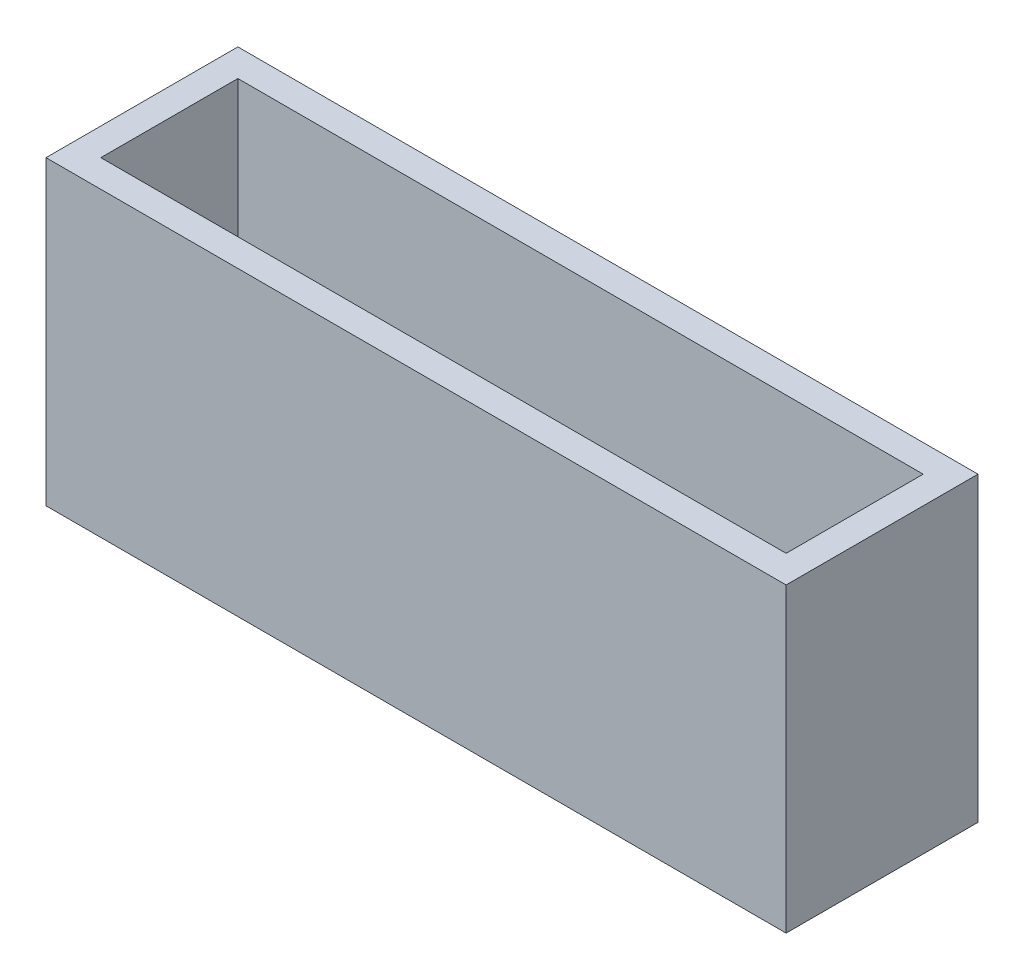
ISO-10303-21;
HEADER;
FILE_DESCRIPTION(('STEP AP214'),'2;1');
FILE_NAME('part.step','',(''),(''),'','','');
FILE_SCHEMA(('AUTOMOTIVE_DESIGN { 1 0 10303 214 1 1 1 1 }'));
ENDSEC;
DATA;
#1=APPLICATION_CONTEXT('core data for automotive mechanical design processes');
#2=APPLICATION_PROTOCOL_DEFINITION('international standard','automotive_design',2000,#1);
#3=PRODUCT_CONTEXT('',#1,'mechanical');
#4=PRODUCT('Part','Part','',(#3));
#5=PRODUCT_RELATED_PRODUCT_CATEGORY('part','',(#4));
#6=PRODUCT_DEFINITION_FORMATION('','',#4);
#7=PRODUCT_DEFINITION_CONTEXT('part definition',#1,'design');
#8=PRODUCT_DEFINITION('design','',#6,#7);
#9=PRODUCT_DEFINITION_SHAPE('','',#8);
#10=(LENGTH_UNIT() NAMED_UNIT(*) SI_UNIT(.MILLI.,.METRE.));
#11=(NAMED_UNIT(*) PLANE_ANGLE_UNIT() SI_UNIT($,.RADIAN.));
#12=(NAMED_UNIT(*) SI_UNIT($,.STERADIAN.) SOLID_ANGLE_UNIT());
#13=UNCERTAINTY_MEASURE_WITH_UNIT(LENGTH_MEASURE(1.E-05),#10,'distance_accuracy_value','');
#14=(GEOMETRIC_REPRESENTATION_CONTEXT(3) GLOBAL_UNCERTAINTY_ASSIGNED_CONTEXT((#13)) GLOBAL_UNIT_ASSIGNED_CONTEXT((#10,
#11,#12)) REPRESENTATION_CONTEXT('',''));
#15=CARTESIAN_POINT('',(0.,0.,0.));
#16=DIRECTION('',(0.,0.,1.));
#17=DIRECTION('',(1.,0.,0.));
#18=AXIS2_PLACEMENT_3D('',#15,#16,#17);
#19=CARTESIAN_POINT('',(-25.,22.,-5.));
#20=DIRECTION('',(0.,0.,1.));
#21=DIRECTION('',(1.,0.,0.));
#22=AXIS2_PLACEMENT_3D('',#19,#20,#21);
#23=PLANE('',#22);
#24=DIRECTION('',(0.,-1.,0.));
#25=VECTOR('',#24,1.);
#26=CARTESIAN_POINT('',(18.,2.,-5.));
#27=LINE('',#26,#25);
#28=CARTESIAN_POINT('',(18.,2.,-5.));
#29=VERTEX_POINT('',#28);
#30=CARTESIAN_POINT('',(18.,0.,-5.));
#31=VERTEX_POINT('',#30);
#32=EDGE_CURVE('E147',#29,#31,#27,.T.);
#33=ORIENTED_EDGE('',*,*,#32,.F.);
#34=DIRECTION('',(1.,0.,0.));
#35=VECTOR('',#34,1.);
#36=CARTESIAN_POINT('',(0.,2.,-5.));
#37=LINE('',#36,#35);
#38=CARTESIAN_POINT('',(25.,2.,-5.));
#39=VERTEX_POINT('',#38);
#40=EDGE_CURVE('E131',#29,#39,#37,.T.);
#41=ORIENTED_EDGE('',*,*,#40,.T.);
#42=DIRECTION('',(0.,-1.,0.));
#43=VECTOR('',#42,1.);
#44=CARTESIAN_POINT('',(25.,22.,-5.));
#45=LINE('',#44,#43);
#46=CARTESIAN_POINT('',(25.,22.,-5.));
#47=VERTEX_POINT('',#46);
#48=EDGE_CURVE('E144',#47,#39,#45,.T.);
#49=ORIENTED_EDGE('',*,*,#48,.F.);
#50=DIRECTION('',(-1.,0.,0.));
#51=VECTOR('',#50,1.);
#52=CARTESIAN_POINT('',(-25.,22.,-5.));
#53=LINE('',#52,#51);
#54=CARTESIAN_POINT('',(-25.,22.,-5.));
#55=VERTEX_POINT('',#54);
#56=EDGE_CURVE('E397',#47,#55,#53,.T.);
#57=ORIENTED_EDGE('',*,*,#56,.T.);
#58=DIRECTION('',(0.,-1.,0.));
#59=VECTOR('',#58,1.);
#60=CARTESIAN_POINT('',(-25.,22.,-5.));
#61=LINE('',#60,#59);
#62=CARTESIAN_POINT('',(-25.,2.,-5.));
#63=VERTEX_POINT('',#62);
#64=EDGE_CURVE('E154',#55,#63,#61,.T.);
#65=ORIENTED_EDGE('',*,*,#64,.T.);
#66=DIRECTION('',(1.,0.,0.));
#67=VECTOR('',#66,1.);
#68=CARTESIAN_POINT('',(0.,2.,-5.));
#69=LINE('',#68,#67);
#70=CARTESIAN_POINT('',(-18.,2.,-5.));
#71=VERTEX_POINT('',#70);
#72=EDGE_CURVE('E384',#63,#71,#69,.T.);
#73=ORIENTED_EDGE('',*,*,#72,.T.);
#74=DIRECTION('',(0.,-1.,0.));
#75=VECTOR('',#74,1.);
#76=CARTESIAN_POINT('',(-18.,2.,-5.));
#77=LINE('',#76,#75);
#78=CARTESIAN_POINT('',(-18.,0.,-5.));
#79=VERTEX_POINT('',#78);
#80=EDGE_CURVE('E387',#71,#79,#77,.T.);
#81=ORIENTED_EDGE('',*,*,#80,.T.);
#82=DIRECTION('',(-1.,0.,0.));
#83=VECTOR('',#82,1.);
#84=CARTESIAN_POINT('',(-25.,0.,-5.));
#85=LINE('',#84,#83);
#86=EDGE_CURVE('E395',#31,#79,#85,.T.);
#87=ORIENTED_EDGE('',*,*,#86,.F.);
#88=EDGE_LOOP('',(#33,#41,#49,#57,#65,#73,#81,#87));
#89=FACE_BOUND('',#88,.T.);
#90=ADVANCED_FACE('F37',(#89),#23,.T.);
#91=CARTESIAN_POINT('',(-25.,22.,5.));
#92=DIRECTION('',(0.,0.,-1.));
#93=DIRECTION('',(-1.,0.,0.));
#94=AXIS2_PLACEMENT_3D('',#91,#92,#93);
#95=PLANE('',#94);
#96=DIRECTION('',(0.,-1.,0.));
#97=VECTOR('',#96,1.);
#98=CARTESIAN_POINT('',(18.,2.,5.));
#99=LINE('',#98,#97);
#100=CARTESIAN_POINT('',(18.,2.,5.));
#101=VERTEX_POINT('',#100);
#102=CARTESIAN_POINT('',(18.,0.,5.));
#103=VERTEX_POINT('',#102);
#104=EDGE_CURVE('E368',#101,#103,#99,.T.);
#105=ORIENTED_EDGE('',*,*,#104,.T.);
#106=DIRECTION('',(1.,0.,0.));
#107=VECTOR('',#106,1.);
#108=CARTESIAN_POINT('',(-25.,0.,5.));
#109=LINE('',#108,#107);
#110=CARTESIAN_POINT('',(-18.,0.,5.));
#111=VERTEX_POINT('',#110);
#112=EDGE_CURVE('E398',#111,#103,#109,.T.);
#113=ORIENTED_EDGE('',*,*,#112,.F.);
#114=DIRECTION('',(0.,-1.,0.));
#115=VECTOR('',#114,1.);
#116=CARTESIAN_POINT('',(-18.,2.,5.));
#117=LINE('',#116,#115);
#118=CARTESIAN_POINT('',(-18.,2.,5.));
#119=VERTEX_POINT('',#118);
#120=EDGE_CURVE('E393',#119,#111,#117,.T.);
#121=ORIENTED_EDGE('',*,*,#120,.F.);
#122=DIRECTION('',(1.,0.,0.));
#123=VECTOR('',#122,1.);
#124=CARTESIAN_POINT('',(0.,2.,5.));
#125=LINE('',#124,#123);
#126=CARTESIAN_POINT('',(-25.,2.,5.));
#127=VERTEX_POINT('',#126);
#128=EDGE_CURVE('E380',#127,#119,#125,.T.);
#129=ORIENTED_EDGE('',*,*,#128,.F.);
#130=DIRECTION('',(0.,-1.,0.));
#131=VECTOR('',#130,1.);
#132=CARTESIAN_POINT('',(-25.,22.,5.));
#133=LINE('',#132,#131);
#134=CARTESIAN_POINT('',(-25.,22.,5.));
#135=VERTEX_POINT('',#134);
#136=EDGE_CURVE('E60',#135,#127,#133,.T.);
#137=ORIENTED_EDGE('',*,*,#136,.F.);
#138=DIRECTION('',(1.,0.,0.));
#139=VECTOR('',#138,1.);
#140=CARTESIAN_POINT('',(-25.,22.,5.));
#141=LINE('',#140,#139);
#142=CARTESIAN_POINT('',(25.,22.,5.));
#143=VERTEX_POINT('',#142);
#144=EDGE_CURVE('E402',#135,#143,#141,.T.);
#145=ORIENTED_EDGE('',*,*,#144,.T.);
#146=DIRECTION('',(0.,-1.,0.));
#147=VECTOR('',#146,1.);
#148=CARTESIAN_POINT('',(25.,22.,5.));
#149=LINE('',#148,#147);
#150=CARTESIAN_POINT('',(25.,2.,5.));
#151=VERTEX_POINT('',#150);
#152=EDGE_CURVE('E404',#143,#151,#149,.T.);
#153=ORIENTED_EDGE('',*,*,#152,.T.);
#154=DIRECTION('',(1.,0.,0.));
#155=VECTOR('',#154,1.);
#156=CARTESIAN_POINT('',(0.,2.,5.00000000000003));
#157=LINE('',#156,#155);
#158=EDGE_CURVE('E134',#101,#151,#157,.T.);
#159=ORIENTED_EDGE('',*,*,#158,.F.);
#160=EDGE_LOOP('',(#105,#113,#121,#129,#137,#145,#153,#159));
#161=FACE_BOUND('',#160,.T.);
#162=ADVANCED_FACE('F213',(#161),#95,.T.);
#163=CARTESIAN_POINT('',(0.,22.,0.));
#164=DIRECTION('',(0.,-1.,0.));
#165=DIRECTION('',(0.,0.,-1.));
#166=AXIS2_PLACEMENT_3D('',#163,#164,#165);
#167=PLANE('',#166);
#168=DIRECTION('',(0.,0.,-1.));
#169=VECTOR('',#168,1.);
#170=CARTESIAN_POINT('',(27.,22.,7.));
#171=LINE('',#170,#169);
#172=CARTESIAN_POINT('',(27.,22.,7.));
#173=VERTEX_POINT('',#172);
#174=CARTESIAN_POINT('',(27.,22.,-7.));
#175=VERTEX_POINT('',#174);
#176=EDGE_CURVE('E163',#173,#175,#171,.T.);
#177=ORIENTED_EDGE('',*,*,#176,.T.);
#178=DIRECTION('',(-1.,0.,0.));
#179=VECTOR('',#178,1.);
#180=CARTESIAN_POINT('',(-27.,22.,-7.));
#181=LINE('',#180,#179);
#182=CARTESIAN_POINT('',(-27.,22.,-7.));
#183=VERTEX_POINT('',#182);
#184=EDGE_CURVE('E166',#175,#183,#181,.T.);
#185=ORIENTED_EDGE('',*,*,#184,.T.);
#186=DIRECTION('',(0.,0.,1.));
#187=VECTOR('',#186,1.);
#188=CARTESIAN_POINT('',(-27.,22.,7.));
#189=LINE('',#188,#187);
#190=CARTESIAN_POINT('',(-27.,22.,7.));
#191=VERTEX_POINT('',#190);
#192=EDGE_CURVE('E169',#183,#191,#189,.T.);
#193=ORIENTED_EDGE('',*,*,#192,.T.);
#194=DIRECTION('',(1.,0.,0.));
#195=VECTOR('',#194,1.);
#196=CARTESIAN_POINT('',(-27.,22.,7.));
#197=LINE('',#196,#195);
#198=EDGE_CURVE('E171',#191,#173,#197,.T.);
#199=ORIENTED_EDGE('',*,*,#198,.T.);
#200=EDGE_LOOP('',(#177,#185,#193,#199));
#201=FACE_BOUND('',#200,.T.);
#202=DIRECTION('',(0.,0.,-1.));
#203=VECTOR('',#202,1.);
#204=CARTESIAN_POINT('',(25.,22.,5.));
#205=LINE('',#204,#203);
#206=EDGE_CURVE('E152',#143,#47,#205,.T.);
#207=ORIENTED_EDGE('',*,*,#206,.F.);
#208=ORIENTED_EDGE('',*,*,#144,.F.);
#209=DIRECTION('',(0.,0.,1.));
#210=VECTOR('',#209,1.);
#211=CARTESIAN_POINT('',(-25.,22.,5.));
#212=LINE('',#211,#210);
#213=EDGE_CURVE('E400',#55,#135,#212,.T.);
#214=ORIENTED_EDGE('',*,*,#213,.F.);
#215=ORIENTED_EDGE('',*,*,#56,.F.);
#216=EDGE_LOOP('',(#207,#208,#214,#215));
#217=FACE_BOUND('',#216,.T.);
#218=ADVANCED_FACE('F203',(#201,#217),#167,.F.);
#219=CARTESIAN_POINT('',(0.,0.,0.));
#220=DIRECTION('',(0.,-1.,0.));
#221=DIRECTION('',(0.,0.,-1.));
#222=AXIS2_PLACEMENT_3D('',#219,#220,#221);
#223=PLANE('',#222);
#224=DIRECTION('',(0.,0.,-1.));
#225=VECTOR('',#224,1.);
#226=CARTESIAN_POINT('',(18.,0.,0.));
#227=LINE('',#226,#225);
#228=EDGE_CURVE('E360',#103,#31,#227,.T.);
#229=ORIENTED_EDGE('',*,*,#228,.T.);
#230=ORIENTED_EDGE('',*,*,#86,.T.);
#231=DIRECTION('',(0.,0.,-1.));
#232=VECTOR('',#231,1.);
#233=CARTESIAN_POINT('',(-18.,0.,0.));
#234=LINE('',#233,#232);
#235=EDGE_CURVE('E52',#111,#79,#234,.T.);
#236=ORIENTED_EDGE('',*,*,#235,.F.);
#237=ORIENTED_EDGE('',*,*,#112,.T.);
#238=EDGE_LOOP('',(#229,#230,#236,#237));
#239=FACE_BOUND('',#238,.T.);
#240=DIRECTION('',(0.,0.,-1.));
#241=VECTOR('',#240,1.);
#242=CARTESIAN_POINT('',(27.,0.,7.));
#243=LINE('',#242,#241);
#244=CARTESIAN_POINT('',(27.,0.,7.));
#245=VERTEX_POINT('',#244);
#246=CARTESIAN_POINT('',(27.,0.,-7.));
#247=VERTEX_POINT('',#246);
#248=EDGE_CURVE('E153',#245,#247,#243,.T.);
#249=ORIENTED_EDGE('',*,*,#248,.F.);
#250=DIRECTION('',(1.,0.,0.));
#251=VECTOR('',#250,1.);
#252=CARTESIAN_POINT('',(-27.,0.,7.));
#253=LINE('',#252,#251);
#254=CARTESIAN_POINT('',(-27.,0.,7.));
#255=VERTEX_POINT('',#254);
#256=EDGE_CURVE('E167',#255,#245,#253,.T.);
#257=ORIENTED_EDGE('',*,*,#256,.F.);
#258=DIRECTION('',(0.,0.,1.));
#259=VECTOR('',#258,1.);
#260=CARTESIAN_POINT('',(-27.,0.,7.));
#261=LINE('',#260,#259);
#262=CARTESIAN_POINT('',(-27.,0.,-7.));
#263=VERTEX_POINT('',#262);
#264=EDGE_CURVE('E175',#263,#255,#261,.T.);
#265=ORIENTED_EDGE('',*,*,#264,.F.);
#266=DIRECTION('',(-1.,0.,0.));
#267=VECTOR('',#266,1.);
#268=CARTESIAN_POINT('',(-27.,0.,-7.));
#269=LINE('',#268,#267);
#270=EDGE_CURVE('E157',#247,#263,#269,.T.);
#271=ORIENTED_EDGE('',*,*,#270,.F.);
#272=EDGE_LOOP('',(#249,#257,#265,#271));
#273=FACE_BOUND('',#272,.T.);
#274=CARTESIAN_POINT('',(-21.5,0.,0.));
#275=DIRECTION('',(0.,1.,0.));
#276=DIRECTION('',(0.,0.,1.));
#277=AXIS2_PLACEMENT_3D('',#274,#275,#276);
#278=CIRCLE('',#277,1.);
#279=CARTESIAN_POINT('',(-21.5,0.,1.));
#280=VERTEX_POINT('',#279);
#281=EDGE_CURVE('E374',#280,#280,#278,.T.);
#282=ORIENTED_EDGE('',*,*,#281,.T.);
#283=EDGE_LOOP('',(#282));
#284=FACE_BOUND('',#283,.T.);
#285=CARTESIAN_POINT('',(21.5,0.,0.));
#286=DIRECTION('',(0.,1.,0.));
#287=DIRECTION('',(0.,0.,1.));
#288=AXIS2_PLACEMENT_3D('',#285,#286,#287);
#289=CIRCLE('',#288,1.);
#290=CARTESIAN_POINT('',(21.5,0.,1.));
#291=VERTEX_POINT('',#290);
#292=EDGE_CURVE('E363',#291,#291,#289,.T.);
#293=ORIENTED_EDGE('',*,*,#292,.T.);
#294=EDGE_LOOP('',(#293));
#295=FACE_BOUND('',#294,.T.);
#296=ADVANCED_FACE('F193',(#239,#273,#284,#295),#223,.T.);
#297=CARTESIAN_POINT('',(27.,22.,7.));
#298=DIRECTION('',(-1.,0.,0.));
#299=DIRECTION('',(0.,0.,1.));
#300=AXIS2_PLACEMENT_3D('',#297,#298,#299);
#301=PLANE('',#300);
#302=ORIENTED_EDGE('',*,*,#248,.T.);
#303=DIRECTION('',(0.,-1.,0.));
#304=VECTOR('',#303,1.);
#305=CARTESIAN_POINT('',(27.,22.,-7.));
#306=LINE('',#305,#304);
#307=EDGE_CURVE('E11',#175,#247,#306,.T.);
#308=ORIENTED_EDGE('',*,*,#307,.F.);
#309=ORIENTED_EDGE('',*,*,#176,.F.);
#310=DIRECTION('',(0.,-1.,0.));
#311=VECTOR('',#310,1.);
#312=CARTESIAN_POINT('',(27.,22.,7.));
#313=LINE('',#312,#311);
#314=EDGE_CURVE('E172',#173,#245,#313,.T.);
#315=ORIENTED_EDGE('',*,*,#314,.T.);
#316=EDGE_LOOP('',(#302,#308,#309,#315));
#317=FACE_BOUND('',#316,.T.);
#318=ADVANCED_FACE('F39',(#317),#301,.F.);
#319=CARTESIAN_POINT('',(-27.,22.,-7.));
#320=DIRECTION('',(0.,0.,1.));
#321=DIRECTION('',(1.,0.,0.));
#322=AXIS2_PLACEMENT_3D('',#319,#320,#321);
#323=PLANE('',#322);
#324=ORIENTED_EDGE('',*,*,#270,.T.);
#325=DIRECTION('',(0.,-1.,0.));
#326=VECTOR('',#325,1.);
#327=CARTESIAN_POINT('',(-27.,22.,-7.));
#328=LINE('',#327,#326);
#329=EDGE_CURVE('E45',#183,#263,#328,.T.);
#330=ORIENTED_EDGE('',*,*,#329,.F.);
#331=ORIENTED_EDGE('',*,*,#184,.F.);
#332=ORIENTED_EDGE('',*,*,#307,.T.);
#333=EDGE_LOOP('',(#324,#330,#331,#332));
#334=FACE_BOUND('',#333,.T.);
#335=ADVANCED_FACE('F205',(#334),#323,.F.);
#336=CARTESIAN_POINT('',(-27.,22.,7.));
#337=DIRECTION('',(1.,0.,0.));
#338=DIRECTION('',(0.,0.,-1.));
#339=AXIS2_PLACEMENT_3D('',#336,#337,#338);
#340=PLANE('',#339);
#341=ORIENTED_EDGE('',*,*,#264,.T.);
#342=DIRECTION('',(0.,-1.,0.));
#343=VECTOR('',#342,1.);
#344=CARTESIAN_POINT('',(-27.,22.,7.));
#345=LINE('',#344,#343);
#346=EDGE_CURVE('E180',#191,#255,#345,.T.);
#347=ORIENTED_EDGE('',*,*,#346,.F.);
#348=ORIENTED_EDGE('',*,*,#192,.F.);
#349=ORIENTED_EDGE('',*,*,#329,.T.);
#350=EDGE_LOOP('',(#341,#347,#348,#349));
#351=FACE_BOUND('',#350,.T.);
#352=ADVANCED_FACE('F187',(#351),#340,.F.);
#353=CARTESIAN_POINT('',(-27.,22.,7.));
#354=DIRECTION('',(0.,0.,-1.));
#355=DIRECTION('',(-1.,0.,0.));
#356=AXIS2_PLACEMENT_3D('',#353,#354,#355);
#357=PLANE('',#356);
#358=ORIENTED_EDGE('',*,*,#256,.T.);
#359=ORIENTED_EDGE('',*,*,#314,.F.);
#360=ORIENTED_EDGE('',*,*,#198,.F.);
#361=ORIENTED_EDGE('',*,*,#346,.T.);
#362=EDGE_LOOP('',(#358,#359,#360,#361));
#363=FACE_BOUND('',#362,.T.);
#364=ADVANCED_FACE('F197',(#363),#357,.F.);
#365=CARTESIAN_POINT('',(25.,22.,5.));
#366=DIRECTION('',(-1.,0.,0.));
#367=DIRECTION('',(0.,0.,1.));
#368=AXIS2_PLACEMENT_3D('',#365,#366,#367);
#369=PLANE('',#368);
#370=DIRECTION('',(0.,0.,1.));
#371=VECTOR('',#370,1.);
#372=CARTESIAN_POINT('',(25.,2.,0.));
#373=LINE('',#372,#371);
#374=EDGE_CURVE('E127',#39,#151,#373,.T.);
#375=ORIENTED_EDGE('',*,*,#374,.T.);
#376=ORIENTED_EDGE('',*,*,#152,.F.);
#377=ORIENTED_EDGE('',*,*,#206,.T.);
#378=ORIENTED_EDGE('',*,*,#48,.T.);
#379=EDGE_LOOP('',(#375,#376,#377,#378));
#380=FACE_BOUND('',#379,.T.);
#381=ADVANCED_FACE('F150',(#380),#369,.T.);
#382=CARTESIAN_POINT('',(-25.,22.,5.));
#383=DIRECTION('',(1.,0.,0.));
#384=DIRECTION('',(0.,0.,-1.));
#385=AXIS2_PLACEMENT_3D('',#382,#383,#384);
#386=PLANE('',#385);
#387=DIRECTION('',(0.,0.,1.));
#388=VECTOR('',#387,1.);
#389=CARTESIAN_POINT('',(-25.,2.,0.));
#390=LINE('',#389,#388);
#391=EDGE_CURVE('E378',#63,#127,#390,.T.);
#392=ORIENTED_EDGE('',*,*,#391,.F.);
#393=ORIENTED_EDGE('',*,*,#64,.F.);
#394=ORIENTED_EDGE('',*,*,#213,.T.);
#395=ORIENTED_EDGE('',*,*,#136,.T.);
#396=EDGE_LOOP('',(#392,#393,#394,#395));
#397=FACE_BOUND('',#396,.T.);
#398=ADVANCED_FACE('F221',(#397),#386,.T.);
#399=CARTESIAN_POINT('',(-18.,2.,0.));
#400=DIRECTION('',(-1.,0.,0.));
#401=DIRECTION('',(0.,0.,1.));
#402=AXIS2_PLACEMENT_3D('',#399,#400,#401);
#403=PLANE('',#402);
#404=ORIENTED_EDGE('',*,*,#235,.T.);
#405=ORIENTED_EDGE('',*,*,#80,.F.);
#406=DIRECTION('',(0.,0.,-1.));
#407=VECTOR('',#406,1.);
#408=CARTESIAN_POINT('',(-18.,2.,0.));
#409=LINE('',#408,#407);
#410=EDGE_CURVE('E382',#119,#71,#409,.T.);
#411=ORIENTED_EDGE('',*,*,#410,.F.);
#412=ORIENTED_EDGE('',*,*,#120,.T.);
#413=EDGE_LOOP('',(#404,#405,#411,#412));
#414=FACE_BOUND('',#413,.T.);
#415=ADVANCED_FACE('F244',(#414),#403,.F.);
#416=CARTESIAN_POINT('',(-21.5,2.,0.));
#417=DIRECTION('',(0.,-1.,0.));
#418=DIRECTION('',(0.,0.,-1.));
#419=AXIS2_PLACEMENT_3D('',#416,#417,#418);
#420=CYLINDRICAL_SURFACE('',#419,1.);
#421=CARTESIAN_POINT('',(-21.5,2.,0.));
#422=DIRECTION('',(0.,1.,0.));
#423=DIRECTION('',(0.,0.,1.));
#424=AXIS2_PLACEMENT_3D('',#421,#422,#423);
#425=CIRCLE('',#424,1.);
#426=CARTESIAN_POINT('',(-21.5,2.,1.));
#427=VERTEX_POINT('',#426);
#428=EDGE_CURVE('E375',#427,#427,#425,.T.);
#429=ORIENTED_EDGE('',*,*,#428,.T.);
#430=EDGE_LOOP('',(#429));
#431=FACE_BOUND('',#430,.T.);
#432=ORIENTED_EDGE('',*,*,#281,.F.);
#433=EDGE_LOOP('',(#432));
#434=FACE_BOUND('',#433,.T.);
#435=ADVANCED_FACE('F251',(#431,#434),#420,.F.);
#436=CARTESIAN_POINT('',(0.,2.,0.));
#437=DIRECTION('',(0.,1.,0.));
#438=DIRECTION('',(0.,0.,1.));
#439=AXIS2_PLACEMENT_3D('',#436,#437,#438);
#440=PLANE('',#439);
#441=ORIENTED_EDGE('',*,*,#428,.F.);
#442=EDGE_LOOP('',(#441));
#443=FACE_BOUND('',#442,.T.);
#444=ORIENTED_EDGE('',*,*,#391,.T.);
#445=ORIENTED_EDGE('',*,*,#128,.T.);
#446=ORIENTED_EDGE('',*,*,#410,.T.);
#447=ORIENTED_EDGE('',*,*,#72,.F.);
#448=EDGE_LOOP('',(#444,#445,#446,#447));
#449=FACE_BOUND('',#448,.T.);
#450=ADVANCED_FACE('F259',(#443,#449),#440,.T.);
#451=CARTESIAN_POINT('',(18.,2.,0.));
#452=DIRECTION('',(-1.,0.,0.));
#453=DIRECTION('',(0.,0.,1.));
#454=AXIS2_PLACEMENT_3D('',#451,#452,#453);
#455=PLANE('',#454);
#456=ORIENTED_EDGE('',*,*,#228,.F.);
#457=ORIENTED_EDGE('',*,*,#104,.F.);
#458=DIRECTION('',(0.,0.,-1.));
#459=VECTOR('',#458,1.);
#460=CARTESIAN_POINT('',(18.,2.,0.));
#461=LINE('',#460,#459);
#462=EDGE_CURVE('E148',#101,#29,#461,.T.);
#463=ORIENTED_EDGE('',*,*,#462,.T.);
#464=ORIENTED_EDGE('',*,*,#32,.T.);
#465=EDGE_LOOP('',(#456,#457,#463,#464));
#466=FACE_BOUND('',#465,.T.);
#467=ADVANCED_FACE('F267',(#466),#455,.T.);
#468=CARTESIAN_POINT('',(21.5,2.,0.));
#469=DIRECTION('',(0.,-1.,0.));
#470=DIRECTION('',(0.,0.,-1.));
#471=AXIS2_PLACEMENT_3D('',#468,#469,#470);
#472=CYLINDRICAL_SURFACE('',#471,1.);
#473=CARTESIAN_POINT('',(21.5,2.,0.));
#474=DIRECTION('',(0.,1.,0.));
#475=DIRECTION('',(0.,0.,1.));
#476=AXIS2_PLACEMENT_3D('',#473,#474,#475);
#477=CIRCLE('',#476,1.);
#478=CARTESIAN_POINT('',(21.5,2.,1.));
#479=VERTEX_POINT('',#478);
#480=EDGE_CURVE('E139',#479,#479,#477,.T.);
#481=ORIENTED_EDGE('',*,*,#480,.T.);
#482=EDGE_LOOP('',(#481));
#483=FACE_BOUND('',#482,.T.);
#484=ORIENTED_EDGE('',*,*,#292,.F.);
#485=EDGE_LOOP('',(#484));
#486=FACE_BOUND('',#485,.T.);
#487=ADVANCED_FACE('F275',(#483,#486),#472,.F.);
#488=CARTESIAN_POINT('',(0.,2.,0.));
#489=DIRECTION('',(0.,1.,0.));
#490=DIRECTION('',(0.,0.,1.));
#491=AXIS2_PLACEMENT_3D('',#488,#489,#490);
#492=PLANE('',#491);
#493=ORIENTED_EDGE('',*,*,#480,.F.);
#494=EDGE_LOOP('',(#493));
#495=FACE_BOUND('',#494,.T.);
#496=ORIENTED_EDGE('',*,*,#374,.F.);
#497=ORIENTED_EDGE('',*,*,#40,.F.);
#498=ORIENTED_EDGE('',*,*,#462,.F.);
#499=ORIENTED_EDGE('',*,*,#158,.T.);
#500=EDGE_LOOP('',(#496,#497,#498,#499));
#501=FACE_BOUND('',#500,.T.);
#502=ADVANCED_FACE('F129',(#495,#501),#492,.T.);
#503=CLOSED_SHELL('',(#90,#162,#218,#296,#318,#335,#352,#364,#381,#398,#415,#435,#450,#467,#487,#502));
#504=MANIFOLD_SOLID_BREP('B2',#503);
#505=ADVANCED_BREP_SHAPE_REPRESENTATION('',(#18,#504),#14);
#506=SHAPE_DEFINITION_REPRESENTATION(#9,#505);
ENDSEC;
END-ISO-10303-21;
